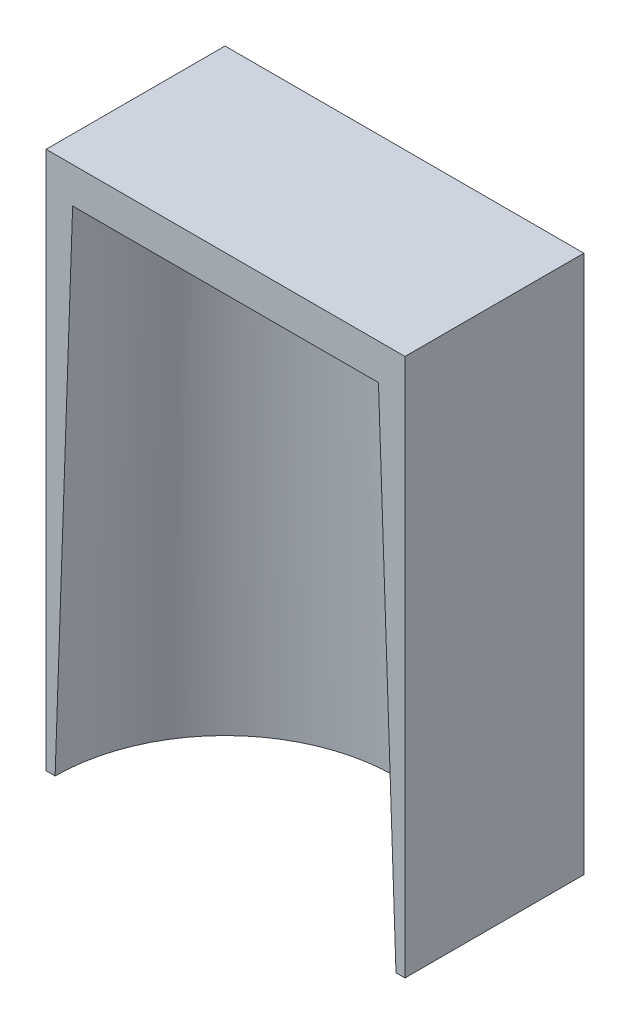
ISO-10303-21;
HEADER;
FILE_DESCRIPTION(('STEP AP214'),'2;1');
FILE_NAME('part.step','',(''),(''),'','','');
FILE_SCHEMA(('AUTOMOTIVE_DESIGN { 1 0 10303 214 1 1 1 1 }'));
ENDSEC;
DATA;
#1=APPLICATION_CONTEXT('core data for automotive mechanical design processes');
#2=APPLICATION_PROTOCOL_DEFINITION('international standard','automotive_design',2000,#1);
#3=PRODUCT_CONTEXT('',#1,'mechanical');
#4=PRODUCT('Part','Part','',(#3));
#5=PRODUCT_RELATED_PRODUCT_CATEGORY('part','',(#4));
#6=PRODUCT_DEFINITION_FORMATION('','',#4);
#7=PRODUCT_DEFINITION_CONTEXT('part definition',#1,'design');
#8=PRODUCT_DEFINITION('design','',#6,#7);
#9=PRODUCT_DEFINITION_SHAPE('','',#8);
#10=(LENGTH_UNIT() NAMED_UNIT(*) SI_UNIT(.MILLI.,.METRE.));
#11=(NAMED_UNIT(*) PLANE_ANGLE_UNIT() SI_UNIT($,.RADIAN.));
#12=(NAMED_UNIT(*) SI_UNIT($,.STERADIAN.) SOLID_ANGLE_UNIT());
#13=UNCERTAINTY_MEASURE_WITH_UNIT(LENGTH_MEASURE(1.E-05),#10,'distance_accuracy_value','');
#14=(GEOMETRIC_REPRESENTATION_CONTEXT(3) GLOBAL_UNCERTAINTY_ASSIGNED_CONTEXT((#13)) GLOBAL_UNIT_ASSIGNED_CONTEXT((#10,
#11,#12)) REPRESENTATION_CONTEXT('',''));
#15=CARTESIAN_POINT('',(0.,0.,0.));
#16=DIRECTION('',(0.,0.,1.));
#17=DIRECTION('',(1.,0.,0.));
#18=AXIS2_PLACEMENT_3D('',#15,#16,#17);
#19=CARTESIAN_POINT('',(50.,150.,-50.));
#20=DIRECTION('',(-1.,0.,0.));
#21=DIRECTION('',(0.,0.,1.));
#22=AXIS2_PLACEMENT_3D('',#19,#20,#21);
#23=PLANE('',#22);
#24=DIRECTION('',(0.,0.,-1.));
#25=VECTOR('',#24,1.);
#26=CARTESIAN_POINT('',(50.,0.,-50.));
#27=LINE('',#26,#25);
#28=CARTESIAN_POINT('',(50.,0.,-0.147812211303756));
#29=VERTEX_POINT('',#28);
#30=CARTESIAN_POINT('',(50.,0.,-50.));
#31=VERTEX_POINT('',#30);
#32=EDGE_CURVE('E105',#29,#31,#27,.T.);
#33=ORIENTED_EDGE('',*,*,#32,.T.);
#34=DIRECTION('',(0.,-1.,0.));
#35=VECTOR('',#34,1.);
#36=CARTESIAN_POINT('',(50.,150.,-50.));
#37=LINE('',#36,#35);
#38=CARTESIAN_POINT('',(50.,150.,-50.));
#39=VERTEX_POINT('',#38);
#40=EDGE_CURVE('E156',#39,#31,#37,.T.);
#41=ORIENTED_EDGE('',*,*,#40,.F.);
#42=DIRECTION('',(0.,0.,-1.));
#43=VECTOR('',#42,1.);
#44=CARTESIAN_POINT('',(50.,150.,-50.));
#45=LINE('',#44,#43);
#46=CARTESIAN_POINT('',(50.,150.,-0.147812211303756));
#47=VERTEX_POINT('',#46);
#48=EDGE_CURVE('E171',#47,#39,#45,.T.);
#49=ORIENTED_EDGE('',*,*,#48,.F.);
#50=DIRECTION('',(0.,-1.,0.));
#51=VECTOR('',#50,1.);
#52=CARTESIAN_POINT('',(50.,150.,-0.147812211303756));
#53=LINE('',#52,#51);
#54=EDGE_CURVE('E157',#47,#29,#53,.T.);
#55=ORIENTED_EDGE('',*,*,#54,.T.);
#56=EDGE_LOOP('',(#33,#41,#49,#55));
#57=FACE_BOUND('',#56,.T.);
#58=ADVANCED_FACE('F39',(#57),#23,.F.);
#59=CARTESIAN_POINT('',(-50.,150.,-50.));
#60=DIRECTION('',(0.,0.,1.));
#61=DIRECTION('',(1.,0.,0.));
#62=AXIS2_PLACEMENT_3D('',#59,#60,#61);
#63=PLANE('',#62);
#64=DIRECTION('',(-1.,0.,0.));
#65=VECTOR('',#64,1.);
#66=CARTESIAN_POINT('',(-50.,0.,-50.));
#67=LINE('',#66,#65);
#68=CARTESIAN_POINT('',(-50.,0.,-50.));
#69=VERTEX_POINT('',#68);
#70=EDGE_CURVE('E159',#31,#69,#67,.T.);
#71=ORIENTED_EDGE('',*,*,#70,.T.);
#72=DIRECTION('',(0.,-1.,0.));
#73=VECTOR('',#72,1.);
#74=CARTESIAN_POINT('',(-50.,150.,-50.));
#75=LINE('',#74,#73);
#76=CARTESIAN_POINT('',(-50.,150.,-50.));
#77=VERTEX_POINT('',#76);
#78=EDGE_CURVE('E177',#77,#69,#75,.T.);
#79=ORIENTED_EDGE('',*,*,#78,.F.);
#80=DIRECTION('',(-1.,0.,0.));
#81=VECTOR('',#80,1.);
#82=CARTESIAN_POINT('',(-50.,150.,-50.));
#83=LINE('',#82,#81);
#84=EDGE_CURVE('E92',#39,#77,#83,.T.);
#85=ORIENTED_EDGE('',*,*,#84,.F.);
#86=ORIENTED_EDGE('',*,*,#40,.T.);
#87=EDGE_LOOP('',(#71,#79,#85,#86));
#88=FACE_BOUND('',#87,.T.);
#89=ADVANCED_FACE('F146',(#88),#63,.F.);
#90=CARTESIAN_POINT('',(-50.,150.,-50.));
#91=DIRECTION('',(1.,0.,0.));
#92=DIRECTION('',(0.,0.,-1.));
#93=AXIS2_PLACEMENT_3D('',#90,#91,#92);
#94=PLANE('',#93);
#95=DIRECTION('',(0.,0.,1.));
#96=VECTOR('',#95,1.);
#97=CARTESIAN_POINT('',(-50.,0.,-50.));
#98=LINE('',#97,#96);
#99=CARTESIAN_POINT('',(-50.,0.,-0.147812211303756));
#100=VERTEX_POINT('',#99);
#101=EDGE_CURVE('E162',#69,#100,#98,.T.);
#102=ORIENTED_EDGE('',*,*,#101,.T.);
#103=DIRECTION('',(0.,-1.,0.));
#104=VECTOR('',#103,1.);
#105=CARTESIAN_POINT('',(-50.,150.,-0.147812211303756));
#106=LINE('',#105,#104);
#107=CARTESIAN_POINT('',(-50.,150.,-0.147812211303756));
#108=VERTEX_POINT('',#107);
#109=EDGE_CURVE('E174',#108,#100,#106,.T.);
#110=ORIENTED_EDGE('',*,*,#109,.F.);
#111=DIRECTION('',(0.,0.,1.));
#112=VECTOR('',#111,1.);
#113=CARTESIAN_POINT('',(-50.,150.,-50.));
#114=LINE('',#113,#112);
#115=EDGE_CURVE('E188',#77,#108,#114,.T.);
#116=ORIENTED_EDGE('',*,*,#115,.F.);
#117=ORIENTED_EDGE('',*,*,#78,.T.);
#118=EDGE_LOOP('',(#102,#110,#116,#117));
#119=FACE_BOUND('',#118,.T.);
#120=ADVANCED_FACE('F151',(#119),#94,.F.);
#121=CARTESIAN_POINT('',(-50.,150.,-0.147812211303756));
#122=DIRECTION('',(0.,0.,-1.));
#123=DIRECTION('',(-1.,0.,0.));
#124=AXIS2_PLACEMENT_3D('',#121,#122,#123);
#125=PLANE('',#124);
#126=DIRECTION('',(-1.,0.,0.));
#127=VECTOR('',#126,1.);
#128=CARTESIAN_POINT('',(-50.,140.,-0.147812211303756));
#129=LINE('',#128,#127);
#130=CARTESIAN_POINT('',(42.610835899934,140.,-0.147812211303756));
#131=VERTEX_POINT('',#130);
#132=CARTESIAN_POINT('',(-42.610835899934,140.,-0.147812211303756));
#133=VERTEX_POINT('',#132);
#134=EDGE_CURVE('E11',#131,#133,#129,.T.);
#135=ORIENTED_EDGE('',*,*,#134,.F.);
#136=CARTESIAN_POINT('',(36.7025690854751,309.189443156886,-0.147812211303756));
#137=CARTESIAN_POINT('',(37.5277196781021,285.560412455268,-0.147812211303756));
#138=CARTESIAN_POINT('',(38.3528698671168,261.931381739556,-0.147812211303756));
#139=CARTESIAN_POINT('',(42.4786190136813,143.786228098188,-0.147812211303756));
#140=CARTESIAN_POINT('',(45.7792125757041,49.2701049841152,-0.147812211303756));
#141=CARTESIAN_POINT('',(50.5225429471466,-86.5604931905766,-0.147812211303756));
#142=CARTESIAN_POINT('',(51.9652821388303,-127.874968168005,-0.147812211303756));
#143=CARTESIAN_POINT('',(53.4080210025339,-169.189443156886,-0.147812211303756));
#144=B_SPLINE_CURVE_WITH_KNOTS('',3,(#136,#137,#138,#139,#140,#141,#142,#143),.UNSPECIFIED.,.F.,
.F.,(4,2,2,4),(0.,70.9303016248106,354.651508124053,478.670482685698),.UNSPECIFIED.);
#145=CARTESIAN_POINT('',(47.499770015761,0.,-0.147812211303756));
#146=VERTEX_POINT('',#145);
#147=EDGE_CURVE('E99',#131,#146,#144,.T.);
#148=ORIENTED_EDGE('',*,*,#147,.T.);
#149=DIRECTION('',(1.,0.,0.));
#150=VECTOR('',#149,1.);
#151=CARTESIAN_POINT('',(-50.,0.,-0.147812211303756));
#152=LINE('',#151,#150);
#153=EDGE_CURVE('E84',#146,#29,#152,.T.);
#154=ORIENTED_EDGE('',*,*,#153,.T.);
#155=ORIENTED_EDGE('',*,*,#54,.F.);
#156=DIRECTION('',(1.,0.,0.));
#157=VECTOR('',#156,1.);
#158=CARTESIAN_POINT('',(-50.,150.,-0.147812211303756));
#159=LINE('',#158,#157);
#160=EDGE_CURVE('E63',#108,#47,#159,.T.);
#161=ORIENTED_EDGE('',*,*,#160,.F.);
#162=ORIENTED_EDGE('',*,*,#109,.T.);
#163=CARTESIAN_POINT('',(-47.499770015761,0.,-0.147812211303756));
#164=VERTEX_POINT('',#163);
#165=EDGE_CURVE('E115',#100,#164,#152,.T.);
#166=ORIENTED_EDGE('',*,*,#165,.T.);
#167=CARTESIAN_POINT('',(-53.4080210025339,-169.189443156886,-0.147812211303756));
#168=CARTESIAN_POINT('',(-52.2073072505943,-134.805627384599,-0.147812211303756));
#169=CARTESIAN_POINT('',(-51.0065930152903,-100.421811629191,-0.147812211303756));
#170=CARTESIAN_POINT('',(-45.4381149556425,59.0378173485438,-0.147812211303756));
#171=CARTESIAN_POINT('',(-41.0703452185936,184.113630364393,-0.147812211303756));
#172=CARTESIAN_POINT('',(-36.7025690854751,309.189443156886,-0.147812211303756));
#173=B_SPLINE_CURVE_WITH_KNOTS('',3,(#167,#168,#169,#170,#171,#172),.UNSPECIFIED.,.F.,.F.,(4,2,
4),(0.,103.214323159096,478.670482685698),.UNSPECIFIED.);
#174=EDGE_CURVE('E54',#164,#133,#173,.T.);
#175=ORIENTED_EDGE('',*,*,#174,.T.);
#176=EDGE_LOOP('',(#135,#148,#154,#155,#161,#162,#166,#175));
#177=FACE_BOUND('',#176,.T.);
#178=ADVANCED_FACE('F111',(#177),#125,.F.);
#179=CARTESIAN_POINT('',(0.,150.,0.));
#180=DIRECTION('',(0.,1.,0.));
#181=DIRECTION('',(0.,0.,1.));
#182=AXIS2_PLACEMENT_3D('',#179,#180,#181);
#183=PLANE('',#182);
#184=ORIENTED_EDGE('',*,*,#48,.T.);
#185=ORIENTED_EDGE('',*,*,#84,.T.);
#186=ORIENTED_EDGE('',*,*,#115,.T.);
#187=ORIENTED_EDGE('',*,*,#160,.T.);
#188=EDGE_LOOP('',(#184,#185,#186,#187));
#189=FACE_BOUND('',#188,.T.);
#190=ADVANCED_FACE('F136',(#189),#183,.T.);
#191=CARTESIAN_POINT('',(0.,0.,0.));
#192=DIRECTION('',(0.,1.,0.));
#193=DIRECTION('',(0.,0.,1.));
#194=AXIS2_PLACEMENT_3D('',#191,#192,#193);
#195=PLANE('',#194);
#196=ORIENTED_EDGE('',*,*,#153,.F.);
#197=CARTESIAN_POINT('',(0.,0.,0.));
#198=DIRECTION('',(0.,1.,0.));
#199=DIRECTION('',(0.,0.,1.));
#200=AXIS2_PLACEMENT_3D('',#197,#198,#199);
#201=CIRCLE('',#200,47.5);
#202=EDGE_CURVE('E47',#146,#164,#201,.T.);
#203=ORIENTED_EDGE('',*,*,#202,.T.);
#204=ORIENTED_EDGE('',*,*,#165,.F.);
#205=ORIENTED_EDGE('',*,*,#101,.F.);
#206=ORIENTED_EDGE('',*,*,#70,.F.);
#207=ORIENTED_EDGE('',*,*,#32,.F.);
#208=EDGE_LOOP('',(#196,#203,#204,#205,#206,#207));
#209=FACE_BOUND('',#208,.T.);
#210=ADVANCED_FACE('F139',(#209),#195,.F.);
#211=CARTESIAN_POINT('',(0.,140.,0.));
#212=DIRECTION('',(0.,-1.,0.));
#213=DIRECTION('',(0.,0.,-1.));
#214=AXIS2_PLACEMENT_3D('',#211,#212,#213);
#215=PLANE('',#214);
#216=ORIENTED_EDGE('',*,*,#134,.T.);
#217=CARTESIAN_POINT('',(0.,140.,0.));
#218=DIRECTION('',(0.,-1.,0.));
#219=DIRECTION('',(0.,0.,-1.));
#220=AXIS2_PLACEMENT_3D('',#217,#218,#219);
#221=CIRCLE('',#220,42.6110922711553);
#222=EDGE_CURVE('E102',#133,#131,#221,.T.);
#223=ORIENTED_EDGE('',*,*,#222,.T.);
#224=EDGE_LOOP('',(#216,#223));
#225=FACE_BOUND('',#224,.T.);
#226=ADVANCED_FACE('F108',(#225),#215,.T.);
#227=CARTESIAN_POINT('',(0.,0.,0.));
#228=DIRECTION('',(0.,-1.,0.));
#229=DIRECTION('',(0.,0.,-1.));
#230=AXIS2_PLACEMENT_3D('',#227,#228,#229);
#231=CONICAL_SURFACE('',#230,47.5,0.0349065850398866);
#232=ORIENTED_EDGE('',*,*,#222,.F.);
#233=ORIENTED_EDGE('',*,*,#174,.F.);
#234=ORIENTED_EDGE('',*,*,#202,.F.);
#235=ORIENTED_EDGE('',*,*,#147,.F.);
#236=EDGE_LOOP('',(#232,#233,#234,#235));
#237=FACE_BOUND('',#236,.T.);
#238=ADVANCED_FACE('F101',(#237),#231,.F.);
#239=CLOSED_SHELL('',(#58,#89,#120,#178,#190,#210,#226,#238));
#240=MANIFOLD_SOLID_BREP('B2',#239);
#241=ADVANCED_BREP_SHAPE_REPRESENTATION('',(#18,#240),#14);
#242=SHAPE_DEFINITION_REPRESENTATION(#9,#241);
ENDSEC;
END-ISO-10303-21;
